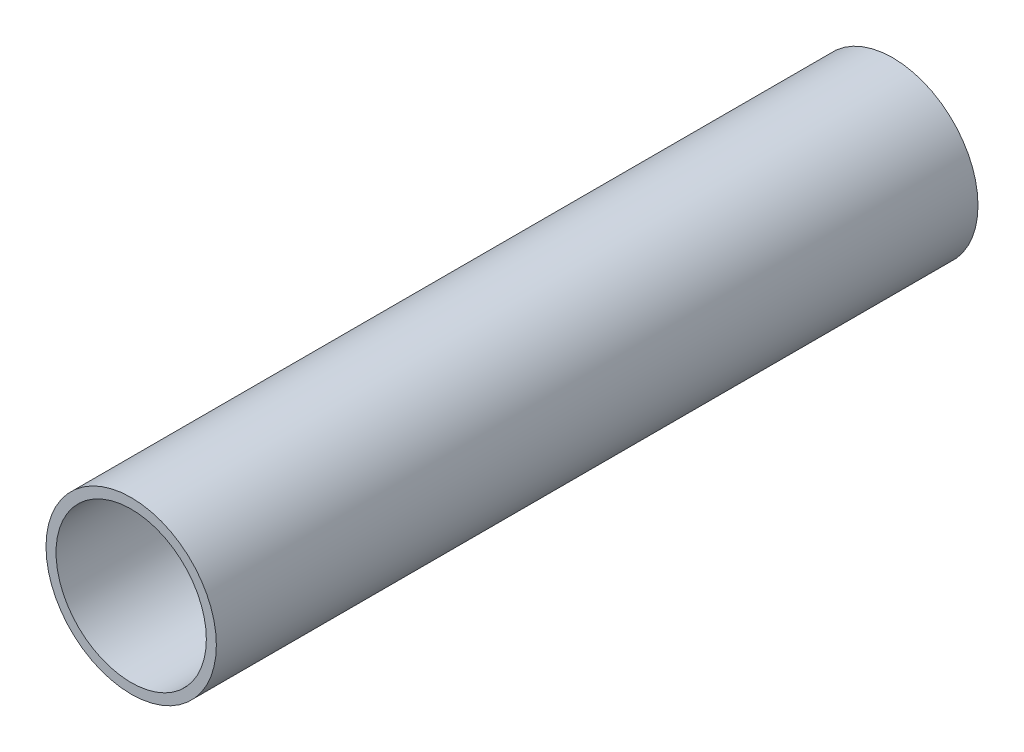
ISO-10303-21;
HEADER;
FILE_DESCRIPTION(('STEP AP214'),'2;1');
FILE_NAME('part.step','',(''),(''),'','','');
FILE_SCHEMA(('AUTOMOTIVE_DESIGN { 1 0 10303 214 1 1 1 1 }'));
ENDSEC;
DATA;
#1=APPLICATION_CONTEXT('core data for automotive mechanical design processes');
#2=APPLICATION_PROTOCOL_DEFINITION('international standard','automotive_design',2000,#1);
#3=PRODUCT_CONTEXT('',#1,'mechanical');
#4=PRODUCT('Part','Part','',(#3));
#5=PRODUCT_RELATED_PRODUCT_CATEGORY('part','',(#4));
#6=PRODUCT_DEFINITION_FORMATION('','',#4);
#7=PRODUCT_DEFINITION_CONTEXT('part definition',#1,'design');
#8=PRODUCT_DEFINITION('design','',#6,#7);
#9=PRODUCT_DEFINITION_SHAPE('','',#8);
#10=(LENGTH_UNIT() NAMED_UNIT(*) SI_UNIT(.MILLI.,.METRE.));
#11=(NAMED_UNIT(*) PLANE_ANGLE_UNIT() SI_UNIT($,.RADIAN.));
#12=(NAMED_UNIT(*) SI_UNIT($,.STERADIAN.) SOLID_ANGLE_UNIT());
#13=UNCERTAINTY_MEASURE_WITH_UNIT(LENGTH_MEASURE(1.E-05),#10,'distance_accuracy_value','');
#14=(GEOMETRIC_REPRESENTATION_CONTEXT(3) GLOBAL_UNCERTAINTY_ASSIGNED_CONTEXT((#13)) GLOBAL_UNIT_ASSIGNED_CONTEXT((#10,
#11,#12)) REPRESENTATION_CONTEXT('',''));
#15=CARTESIAN_POINT('',(0.,0.,0.));
#16=DIRECTION('',(0.,0.,1.));
#17=DIRECTION('',(1.,0.,0.));
#18=AXIS2_PLACEMENT_3D('',#15,#16,#17);
#19=CARTESIAN_POINT('',(0.,0.,2.));
#20=DIRECTION('',(0.,0.,-1.));
#21=DIRECTION('',(-1.,0.,0.));
#22=AXIS2_PLACEMENT_3D('',#19,#20,#21);
#23=CYLINDRICAL_SURFACE('',#22,17.);
#24=CARTESIAN_POINT('',(0.,0.,0.));
#25=DIRECTION('',(0.,0.,1.));
#26=DIRECTION('',(1.,0.,0.));
#27=AXIS2_PLACEMENT_3D('',#24,#25,#26);
#28=CIRCLE('',#27,17.);
#29=CARTESIAN_POINT('',(17.,0.,0.));
#30=VERTEX_POINT('',#29);
#31=EDGE_CURVE('E37',#30,#30,#28,.T.);
#32=ORIENTED_EDGE('',*,*,#31,.T.);
#33=EDGE_LOOP('',(#32));
#34=FACE_BOUND('',#33,.T.);
#35=CARTESIAN_POINT('',(0.,0.,152.));
#36=DIRECTION('',(0.,0.,1.));
#37=DIRECTION('',(1.,0.,0.));
#38=AXIS2_PLACEMENT_3D('',#35,#36,#37);
#39=CIRCLE('',#38,17.);
#40=CARTESIAN_POINT('',(17.,0.,152.));
#41=VERTEX_POINT('',#40);
#42=EDGE_CURVE('E41',#41,#41,#39,.T.);
#43=ORIENTED_EDGE('',*,*,#42,.F.);
#44=EDGE_LOOP('',(#43));
#45=FACE_BOUND('',#44,.T.);
#46=ADVANCED_FACE('F30',(#34,#45),#23,.T.);
#47=CARTESIAN_POINT('',(0.,0.,0.));
#48=DIRECTION('',(0.,0.,1.));
#49=DIRECTION('',(1.,0.,0.));
#50=AXIS2_PLACEMENT_3D('',#47,#48,#49);
#51=PLANE('',#50);
#52=CARTESIAN_POINT('',(0.,0.,0.));
#53=DIRECTION('',(0.,0.,-1.));
#54=DIRECTION('',(-1.,0.,0.));
#55=AXIS2_PLACEMENT_3D('',#52,#53,#54);
#56=CIRCLE('',#55,12.);
#57=CARTESIAN_POINT('',(-12.,0.,0.));
#58=VERTEX_POINT('',#57);
#59=EDGE_CURVE('E49',#58,#58,#56,.T.);
#60=ORIENTED_EDGE('',*,*,#59,.F.);
#61=EDGE_LOOP('',(#60));
#62=FACE_BOUND('',#61,.T.);
#63=ORIENTED_EDGE('',*,*,#31,.F.);
#64=EDGE_LOOP('',(#63));
#65=FACE_BOUND('',#64,.T.);
#66=ADVANCED_FACE('F73',(#62,#65),#51,.F.);
#67=CARTESIAN_POINT('',(0.,0.,152.));
#68=DIRECTION('',(0.,0.,1.));
#69=DIRECTION('',(1.,0.,0.));
#70=AXIS2_PLACEMENT_3D('',#67,#68,#69);
#71=PLANE('',#70);
#72=ORIENTED_EDGE('',*,*,#42,.T.);
#73=EDGE_LOOP('',(#72));
#74=FACE_BOUND('',#73,.T.);
#75=CARTESIAN_POINT('',(0.,0.,152.));
#76=DIRECTION('',(0.,0.,1.));
#77=DIRECTION('',(1.,0.,0.));
#78=AXIS2_PLACEMENT_3D('',#75,#76,#77);
#79=CIRCLE('',#78,15.);
#80=CARTESIAN_POINT('',(15.,0.,152.));
#81=VERTEX_POINT('',#80);
#82=EDGE_CURVE('E46',#81,#81,#79,.T.);
#83=ORIENTED_EDGE('',*,*,#82,.F.);
#84=EDGE_LOOP('',(#83));
#85=FACE_BOUND('',#84,.T.);
#86=ADVANCED_FACE('F68',(#74,#85),#71,.T.);
#87=CARTESIAN_POINT('',(0.,0.,152.));
#88=DIRECTION('',(0.,0.,-1.));
#89=DIRECTION('',(-1.,0.,0.));
#90=AXIS2_PLACEMENT_3D('',#87,#88,#89);
#91=CYLINDRICAL_SURFACE('',#90,15.);
#92=ORIENTED_EDGE('',*,*,#82,.T.);
#93=EDGE_LOOP('',(#92));
#94=FACE_BOUND('',#93,.T.);
#95=CARTESIAN_POINT('',(0.,0.,2.));
#96=DIRECTION('',(0.,0.,1.));
#97=DIRECTION('',(1.,0.,0.));
#98=AXIS2_PLACEMENT_3D('',#95,#96,#97);
#99=CIRCLE('',#98,15.);
#100=CARTESIAN_POINT('',(15.,0.,2.));
#101=VERTEX_POINT('',#100);
#102=EDGE_CURVE('E10',#101,#101,#99,.F.);
#103=ORIENTED_EDGE('',*,*,#102,.T.);
#104=EDGE_LOOP('',(#103));
#105=FACE_BOUND('',#104,.T.);
#106=ADVANCED_FACE('F61',(#94,#105),#91,.F.);
#107=CARTESIAN_POINT('',(0.,0.,2.));
#108=DIRECTION('',(0.,0.,1.));
#109=DIRECTION('',(1.,0.,0.));
#110=AXIS2_PLACEMENT_3D('',#107,#108,#109);
#111=PLANE('',#110);
#112=CARTESIAN_POINT('',(0.,0.,2.));
#113=DIRECTION('',(0.,0.,1.));
#114=DIRECTION('',(1.,0.,0.));
#115=AXIS2_PLACEMENT_3D('',#112,#113,#114);
#116=CIRCLE('',#115,12.);
#117=CARTESIAN_POINT('',(12.,0.,2.));
#118=VERTEX_POINT('',#117);
#119=EDGE_CURVE('E33',#118,#118,#116,.T.);
#120=ORIENTED_EDGE('',*,*,#119,.F.);
#121=EDGE_LOOP('',(#120));
#122=FACE_BOUND('',#121,.T.);
#123=ORIENTED_EDGE('',*,*,#102,.F.);
#124=EDGE_LOOP('',(#123));
#125=FACE_BOUND('',#124,.T.);
#126=ADVANCED_FACE('F58',(#122,#125),#111,.T.);
#127=CARTESIAN_POINT('',(0.,0.,150.));
#128=DIRECTION('',(0.,0.,-1.));
#129=DIRECTION('',(-1.,0.,0.));
#130=AXIS2_PLACEMENT_3D('',#127,#128,#129);
#131=CYLINDRICAL_SURFACE('',#130,12.);
#132=ORIENTED_EDGE('',*,*,#119,.T.);
#133=EDGE_LOOP('',(#132));
#134=FACE_BOUND('',#133,.T.);
#135=ORIENTED_EDGE('',*,*,#59,.T.);
#136=EDGE_LOOP('',(#135));
#137=FACE_BOUND('',#136,.T.);
#138=ADVANCED_FACE('F56',(#134,#137),#131,.F.);
#139=CLOSED_SHELL('',(#46,#66,#86,#106,#126,#138));
#140=MANIFOLD_SOLID_BREP('B2',#139);
#141=ADVANCED_BREP_SHAPE_REPRESENTATION('',(#18,#140),#14);
#142=SHAPE_DEFINITION_REPRESENTATION(#9,#141);
ENDSEC;
END-ISO-10303-21;
